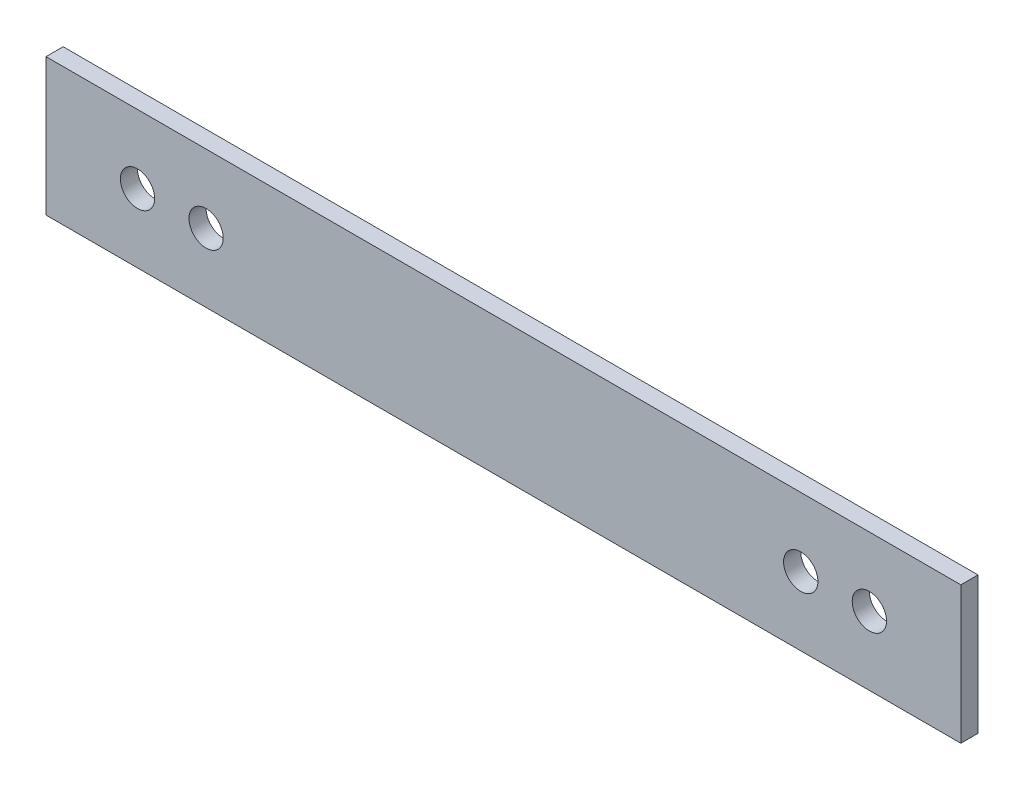
ISO-10303-21;
HEADER;
FILE_DESCRIPTION(('STEP AP214'),'2;1');
FILE_NAME('part.step','',(''),(''),'','','');
FILE_SCHEMA(('AUTOMOTIVE_DESIGN { 1 0 10303 214 1 1 1 1 }'));
ENDSEC;
DATA;
#1=APPLICATION_CONTEXT('core data for automotive mechanical design processes');
#2=APPLICATION_PROTOCOL_DEFINITION('international standard','automotive_design',2000,#1);
#3=PRODUCT_CONTEXT('',#1,'mechanical');
#4=PRODUCT('Part','Part','',(#3));
#5=PRODUCT_RELATED_PRODUCT_CATEGORY('part','',(#4));
#6=PRODUCT_DEFINITION_FORMATION('','',#4);
#7=PRODUCT_DEFINITION_CONTEXT('part definition',#1,'design');
#8=PRODUCT_DEFINITION('design','',#6,#7);
#9=PRODUCT_DEFINITION_SHAPE('','',#8);
#10=(LENGTH_UNIT() NAMED_UNIT(*) SI_UNIT(.MILLI.,.METRE.));
#11=(NAMED_UNIT(*) PLANE_ANGLE_UNIT() SI_UNIT($,.RADIAN.));
#12=(NAMED_UNIT(*) SI_UNIT($,.STERADIAN.) SOLID_ANGLE_UNIT());
#13=UNCERTAINTY_MEASURE_WITH_UNIT(LENGTH_MEASURE(1.E-05),#10,'distance_accuracy_value','');
#14=(GEOMETRIC_REPRESENTATION_CONTEXT(3) GLOBAL_UNCERTAINTY_ASSIGNED_CONTEXT((#13)) GLOBAL_UNIT_ASSIGNED_CONTEXT((#10,
#11,#12)) REPRESENTATION_CONTEXT('',''));
#15=CARTESIAN_POINT('',(0.,0.,0.));
#16=DIRECTION('',(0.,0.,1.));
#17=DIRECTION('',(1.,0.,0.));
#18=AXIS2_PLACEMENT_3D('',#15,#16,#17);
#19=CARTESIAN_POINT('',(0.,0.,4.7625));
#20=DIRECTION('',(0.,0.,-1.));
#21=DIRECTION('',(-1.,0.,0.));
#22=AXIS2_PLACEMENT_3D('',#19,#20,#21);
#23=PLANE('',#22);
#24=DIRECTION('',(0.,-1.,0.));
#25=VECTOR('',#24,1.);
#26=CARTESIAN_POINT('',(0.,0.,4.7625));
#27=LINE('',#26,#25);
#28=CARTESIAN_POINT('',(0.,38.1,4.7625));
#29=VERTEX_POINT('',#28);
#30=CARTESIAN_POINT('',(0.,0.,4.7625));
#31=VERTEX_POINT('',#30);
#32=EDGE_CURVE('E96',#29,#31,#27,.T.);
#33=ORIENTED_EDGE('',*,*,#32,.T.);
#34=DIRECTION('',(1.,0.,0.));
#35=VECTOR('',#34,1.);
#36=CARTESIAN_POINT('',(0.,0.,4.7625));
#37=LINE('',#36,#35);
#38=CARTESIAN_POINT('',(254.,0.,4.7625));
#39=VERTEX_POINT('',#38);
#40=EDGE_CURVE('E91',#31,#39,#37,.T.);
#41=ORIENTED_EDGE('',*,*,#40,.T.);
#42=DIRECTION('',(0.,1.,0.));
#43=VECTOR('',#42,1.);
#44=CARTESIAN_POINT('',(254.,0.,4.7625));
#45=LINE('',#44,#43);
#46=CARTESIAN_POINT('',(254.,38.1,4.7625));
#47=VERTEX_POINT('',#46);
#48=EDGE_CURVE('E94',#39,#47,#45,.T.);
#49=ORIENTED_EDGE('',*,*,#48,.T.);
#50=DIRECTION('',(-1.,0.,0.));
#51=VECTOR('',#50,1.);
#52=CARTESIAN_POINT('',(0.,38.1,4.7625));
#53=LINE('',#52,#51);
#54=EDGE_CURVE('E61',#47,#29,#53,.T.);
#55=ORIENTED_EDGE('',*,*,#54,.T.);
#56=EDGE_LOOP('',(#33,#41,#49,#55));
#57=FACE_BOUND('',#56,.T.);
#58=CARTESIAN_POINT('',(209.55,19.05,4.7625));
#59=DIRECTION('',(0.,0.,1.));
#60=DIRECTION('',(1.,0.,0.));
#61=AXIS2_PLACEMENT_3D('',#58,#59,#60);
#62=CIRCLE('',#61,4.76250000000001);
#63=CARTESIAN_POINT('',(204.7875,19.05,4.7625));
#64=VERTEX_POINT('',#63);
#65=EDGE_CURVE('E116',#64,#64,#62,.T.);
#66=ORIENTED_EDGE('',*,*,#65,.F.);
#67=EDGE_LOOP('',(#66));
#68=FACE_BOUND('',#67,.T.);
#69=CARTESIAN_POINT('',(228.6,19.05,4.7625));
#70=DIRECTION('',(0.,0.,1.));
#71=DIRECTION('',(1.,0.,0.));
#72=AXIS2_PLACEMENT_3D('',#69,#70,#71);
#73=CIRCLE('',#72,4.76250000000001);
#74=CARTESIAN_POINT('',(223.8375,19.05,4.7625));
#75=VERTEX_POINT('',#74);
#76=EDGE_CURVE('E138',#75,#75,#73,.T.);
#77=ORIENTED_EDGE('',*,*,#76,.F.);
#78=EDGE_LOOP('',(#77));
#79=FACE_BOUND('',#78,.T.);
#80=CARTESIAN_POINT('',(25.4,19.05,4.7625));
#81=DIRECTION('',(0.,0.,1.));
#82=DIRECTION('',(1.,0.,0.));
#83=AXIS2_PLACEMENT_3D('',#80,#81,#82);
#84=CIRCLE('',#83,4.7625);
#85=CARTESIAN_POINT('',(20.6375,19.05,4.7625));
#86=VERTEX_POINT('',#85);
#87=EDGE_CURVE('E146',#86,#86,#84,.T.);
#88=ORIENTED_EDGE('',*,*,#87,.F.);
#89=EDGE_LOOP('',(#88));
#90=FACE_BOUND('',#89,.T.);
#91=CARTESIAN_POINT('',(44.45,19.05,4.7625));
#92=DIRECTION('',(0.,0.,1.));
#93=DIRECTION('',(1.,0.,0.));
#94=AXIS2_PLACEMENT_3D('',#91,#92,#93);
#95=CIRCLE('',#94,4.7625);
#96=CARTESIAN_POINT('',(39.6875,19.05,4.7625));
#97=VERTEX_POINT('',#96);
#98=EDGE_CURVE('E154',#97,#97,#95,.T.);
#99=ORIENTED_EDGE('',*,*,#98,.F.);
#100=EDGE_LOOP('',(#99));
#101=FACE_BOUND('',#100,.T.);
#102=ADVANCED_FACE('F43',(#57,#68,#79,#90,#101),#23,.F.);
#103=CARTESIAN_POINT('',(0.,0.,0.));
#104=DIRECTION('',(0.,0.,-1.));
#105=DIRECTION('',(-1.,0.,0.));
#106=AXIS2_PLACEMENT_3D('',#103,#104,#105);
#107=PLANE('',#106);
#108=CARTESIAN_POINT('',(25.4,19.05,0.));
#109=DIRECTION('',(0.,0.,1.));
#110=DIRECTION('',(1.,0.,0.));
#111=AXIS2_PLACEMENT_3D('',#108,#109,#110);
#112=CIRCLE('',#111,4.7625);
#113=CARTESIAN_POINT('',(20.6375,19.05,0.));
#114=VERTEX_POINT('',#113);
#115=EDGE_CURVE('E150',#114,#114,#112,.T.);
#116=ORIENTED_EDGE('',*,*,#115,.T.);
#117=EDGE_LOOP('',(#116));
#118=FACE_BOUND('',#117,.T.);
#119=CARTESIAN_POINT('',(209.55,19.05,0.));
#120=DIRECTION('',(0.,0.,1.));
#121=DIRECTION('',(1.,0.,0.));
#122=AXIS2_PLACEMENT_3D('',#119,#120,#121);
#123=CIRCLE('',#122,4.76250000000001);
#124=CARTESIAN_POINT('',(204.7875,19.05,0.));
#125=VERTEX_POINT('',#124);
#126=EDGE_CURVE('E134',#125,#125,#123,.T.);
#127=ORIENTED_EDGE('',*,*,#126,.T.);
#128=EDGE_LOOP('',(#127));
#129=FACE_BOUND('',#128,.T.);
#130=DIRECTION('',(0.,-1.,0.));
#131=VECTOR('',#130,1.);
#132=CARTESIAN_POINT('',(0.,0.,0.));
#133=LINE('',#132,#131);
#134=CARTESIAN_POINT('',(0.,38.1,0.));
#135=VERTEX_POINT('',#134);
#136=CARTESIAN_POINT('',(0.,0.,0.));
#137=VERTEX_POINT('',#136);
#138=EDGE_CURVE('E112',#135,#137,#133,.T.);
#139=ORIENTED_EDGE('',*,*,#138,.F.);
#140=DIRECTION('',(-1.,0.,0.));
#141=VECTOR('',#140,1.);
#142=CARTESIAN_POINT('',(0.,38.1,0.));
#143=LINE('',#142,#141);
#144=CARTESIAN_POINT('',(254.,38.1,0.));
#145=VERTEX_POINT('',#144);
#146=EDGE_CURVE('E84',#145,#135,#143,.T.);
#147=ORIENTED_EDGE('',*,*,#146,.F.);
#148=DIRECTION('',(0.,1.,0.));
#149=VECTOR('',#148,1.);
#150=CARTESIAN_POINT('',(254.,0.,0.));
#151=LINE('',#150,#149);
#152=CARTESIAN_POINT('',(254.,0.,0.));
#153=VERTEX_POINT('',#152);
#154=EDGE_CURVE('E78',#153,#145,#151,.T.);
#155=ORIENTED_EDGE('',*,*,#154,.F.);
#156=DIRECTION('',(1.,0.,0.));
#157=VECTOR('',#156,1.);
#158=CARTESIAN_POINT('',(0.,0.,0.));
#159=LINE('',#158,#157);
#160=EDGE_CURVE('E101',#137,#153,#159,.T.);
#161=ORIENTED_EDGE('',*,*,#160,.F.);
#162=EDGE_LOOP('',(#139,#147,#155,#161));
#163=FACE_BOUND('',#162,.T.);
#164=CARTESIAN_POINT('',(228.6,19.05,0.));
#165=DIRECTION('',(0.,0.,1.));
#166=DIRECTION('',(1.,0.,0.));
#167=AXIS2_PLACEMENT_3D('',#164,#165,#166);
#168=CIRCLE('',#167,4.76250000000001);
#169=CARTESIAN_POINT('',(223.8375,19.05,0.));
#170=VERTEX_POINT('',#169);
#171=EDGE_CURVE('E142',#170,#170,#168,.T.);
#172=ORIENTED_EDGE('',*,*,#171,.T.);
#173=EDGE_LOOP('',(#172));
#174=FACE_BOUND('',#173,.T.);
#175=CARTESIAN_POINT('',(44.45,19.05,0.));
#176=DIRECTION('',(0.,0.,1.));
#177=DIRECTION('',(1.,0.,0.));
#178=AXIS2_PLACEMENT_3D('',#175,#176,#177);
#179=CIRCLE('',#178,4.7625);
#180=CARTESIAN_POINT('',(39.6875,19.05,0.));
#181=VERTEX_POINT('',#180);
#182=EDGE_CURVE('E158',#181,#181,#179,.T.);
#183=ORIENTED_EDGE('',*,*,#182,.T.);
#184=EDGE_LOOP('',(#183));
#185=FACE_BOUND('',#184,.T.);
#186=ADVANCED_FACE('F129',(#118,#129,#163,#174,#185),#107,.T.);
#187=CARTESIAN_POINT('',(0.,0.,4.7625));
#188=DIRECTION('',(1.,0.,0.));
#189=DIRECTION('',(0.,0.,-1.));
#190=AXIS2_PLACEMENT_3D('',#187,#188,#189);
#191=PLANE('',#190);
#192=ORIENTED_EDGE('',*,*,#138,.T.);
#193=DIRECTION('',(0.,0.,-1.));
#194=VECTOR('',#193,1.);
#195=CARTESIAN_POINT('',(0.,0.,4.7625));
#196=LINE('',#195,#194);
#197=EDGE_CURVE('E11',#31,#137,#196,.T.);
#198=ORIENTED_EDGE('',*,*,#197,.F.);
#199=ORIENTED_EDGE('',*,*,#32,.F.);
#200=DIRECTION('',(0.,0.,-1.));
#201=VECTOR('',#200,1.);
#202=CARTESIAN_POINT('',(0.,38.1,4.7625));
#203=LINE('',#202,#201);
#204=EDGE_CURVE('E108',#29,#135,#203,.T.);
#205=ORIENTED_EDGE('',*,*,#204,.T.);
#206=EDGE_LOOP('',(#192,#198,#199,#205));
#207=FACE_BOUND('',#206,.T.);
#208=ADVANCED_FACE('F45',(#207),#191,.F.);
#209=CARTESIAN_POINT('',(0.,0.,4.7625));
#210=DIRECTION('',(0.,1.,0.));
#211=DIRECTION('',(0.,0.,1.));
#212=AXIS2_PLACEMENT_3D('',#209,#210,#211);
#213=PLANE('',#212);
#214=ORIENTED_EDGE('',*,*,#160,.T.);
#215=DIRECTION('',(0.,0.,-1.));
#216=VECTOR('',#215,1.);
#217=CARTESIAN_POINT('',(254.,0.,4.7625));
#218=LINE('',#217,#216);
#219=EDGE_CURVE('E53',#39,#153,#218,.T.);
#220=ORIENTED_EDGE('',*,*,#219,.F.);
#221=ORIENTED_EDGE('',*,*,#40,.F.);
#222=ORIENTED_EDGE('',*,*,#197,.T.);
#223=EDGE_LOOP('',(#214,#220,#221,#222));
#224=FACE_BOUND('',#223,.T.);
#225=ADVANCED_FACE('F100',(#224),#213,.F.);
#226=CARTESIAN_POINT('',(254.,0.,4.7625));
#227=DIRECTION('',(-1.,0.,0.));
#228=DIRECTION('',(0.,0.,1.));
#229=AXIS2_PLACEMENT_3D('',#226,#227,#228);
#230=PLANE('',#229);
#231=ORIENTED_EDGE('',*,*,#154,.T.);
#232=DIRECTION('',(0.,0.,-1.));
#233=VECTOR('',#232,1.);
#234=CARTESIAN_POINT('',(254.,38.1,4.7625));
#235=LINE('',#234,#233);
#236=EDGE_CURVE('E103',#47,#145,#235,.T.);
#237=ORIENTED_EDGE('',*,*,#236,.F.);
#238=ORIENTED_EDGE('',*,*,#48,.F.);
#239=ORIENTED_EDGE('',*,*,#219,.T.);
#240=EDGE_LOOP('',(#231,#237,#238,#239));
#241=FACE_BOUND('',#240,.T.);
#242=ADVANCED_FACE('F104',(#241),#230,.F.);
#243=CARTESIAN_POINT('',(0.,38.1,4.7625));
#244=DIRECTION('',(0.,-1.,0.));
#245=DIRECTION('',(0.,0.,-1.));
#246=AXIS2_PLACEMENT_3D('',#243,#244,#245);
#247=PLANE('',#246);
#248=ORIENTED_EDGE('',*,*,#146,.T.);
#249=ORIENTED_EDGE('',*,*,#204,.F.);
#250=ORIENTED_EDGE('',*,*,#54,.F.);
#251=ORIENTED_EDGE('',*,*,#236,.T.);
#252=EDGE_LOOP('',(#248,#249,#250,#251));
#253=FACE_BOUND('',#252,.T.);
#254=ADVANCED_FACE('F126',(#253),#247,.F.);
#255=CARTESIAN_POINT('',(209.55,19.05,4.7625));
#256=DIRECTION('',(0.,0.,-1.));
#257=DIRECTION('',(-1.,0.,0.));
#258=AXIS2_PLACEMENT_3D('',#255,#256,#257);
#259=CYLINDRICAL_SURFACE('',#258,4.76250000000001);
#260=CARTESIAN_POINT('',(204.7875,19.05,4.7625));
#261=CARTESIAN_POINT('',(204.7875,19.05,4.712890625));
#262=CARTESIAN_POINT('',(204.7875,19.05,4.66328125));
#263=CARTESIAN_POINT('',(204.7875,19.05,4.5640625));
#264=CARTESIAN_POINT('',(204.7875,19.05,4.514453125));
#265=CARTESIAN_POINT('',(204.7875,19.05,4.415234375));
#266=CARTESIAN_POINT('',(204.7875,19.05,4.365625));
#267=CARTESIAN_POINT('',(204.7875,19.05,4.26640625));
#268=CARTESIAN_POINT('',(204.7875,19.05,4.216796875));
#269=CARTESIAN_POINT('',(204.7875,19.05,4.117578125));
#270=CARTESIAN_POINT('',(204.7875,19.05,4.06796875));
#271=CARTESIAN_POINT('',(204.7875,19.05,3.96875));
#272=CARTESIAN_POINT('',(204.7875,19.05,3.919140625));
#273=CARTESIAN_POINT('',(204.7875,19.05,3.819921875));
#274=CARTESIAN_POINT('',(204.7875,19.05,3.7703125));
#275=CARTESIAN_POINT('',(204.7875,19.05,3.67109375));
#276=CARTESIAN_POINT('',(204.7875,19.05,3.621484375));
#277=CARTESIAN_POINT('',(204.7875,19.05,3.522265625));
#278=CARTESIAN_POINT('',(204.7875,19.05,3.47265625));
#279=CARTESIAN_POINT('',(204.7875,19.05,3.3734375));
#280=CARTESIAN_POINT('',(204.7875,19.05,3.323828125));
#281=CARTESIAN_POINT('',(204.7875,19.05,3.224609375));
#282=CARTESIAN_POINT('',(204.7875,19.05,3.175));
#283=CARTESIAN_POINT('',(204.7875,19.05,3.07578125));
#284=CARTESIAN_POINT('',(204.7875,19.05,3.026171875));
#285=CARTESIAN_POINT('',(204.7875,19.05,2.926953125));
#286=CARTESIAN_POINT('',(204.7875,19.05,2.87734375));
#287=CARTESIAN_POINT('',(204.7875,19.05,2.778125));
#288=CARTESIAN_POINT('',(204.7875,19.05,2.728515625));
#289=CARTESIAN_POINT('',(204.7875,19.05,2.629296875));
#290=CARTESIAN_POINT('',(204.7875,19.05,2.5796875));
#291=CARTESIAN_POINT('',(204.7875,19.05,2.48046875));
#292=CARTESIAN_POINT('',(204.7875,19.05,2.430859375));
#293=CARTESIAN_POINT('',(204.7875,19.05,2.331640625));
#294=CARTESIAN_POINT('',(204.7875,19.05,2.28203125));
#295=CARTESIAN_POINT('',(204.7875,19.05,2.1828125));
#296=CARTESIAN_POINT('',(204.7875,19.05,2.133203125));
#297=CARTESIAN_POINT('',(204.7875,19.05,2.033984375));
#298=CARTESIAN_POINT('',(204.7875,19.05,1.984375));
#299=CARTESIAN_POINT('',(204.7875,19.05,1.88515625));
#300=CARTESIAN_POINT('',(204.7875,19.05,1.835546875));
#301=CARTESIAN_POINT('',(204.7875,19.05,1.736328125));
#302=CARTESIAN_POINT('',(204.7875,19.05,1.68671875));
#303=CARTESIAN_POINT('',(204.7875,19.05,1.5875));
#304=CARTESIAN_POINT('',(204.7875,19.05,1.537890625));
#305=CARTESIAN_POINT('',(204.7875,19.05,1.438671875));
#306=CARTESIAN_POINT('',(204.7875,19.05,1.3890625));
#307=CARTESIAN_POINT('',(204.7875,19.05,1.28984375));
#308=CARTESIAN_POINT('',(204.7875,19.05,1.240234375));
#309=CARTESIAN_POINT('',(204.7875,19.05,1.141015625));
#310=CARTESIAN_POINT('',(204.7875,19.05,1.09140625));
#311=CARTESIAN_POINT('',(204.7875,19.05,0.992187499999999));
#312=CARTESIAN_POINT('',(204.7875,19.05,0.942578124999999));
#313=CARTESIAN_POINT('',(204.7875,19.05,0.843359375));
#314=CARTESIAN_POINT('',(204.7875,19.05,0.79375));
#315=CARTESIAN_POINT('',(204.7875,19.05,0.69453125));
#316=CARTESIAN_POINT('',(204.7875,19.05,0.644921875));
#317=CARTESIAN_POINT('',(204.7875,19.05,0.545703125));
#318=CARTESIAN_POINT('',(204.7875,19.05,0.49609375));
#319=CARTESIAN_POINT('',(204.7875,19.05,0.396875));
#320=CARTESIAN_POINT('',(204.7875,19.05,0.347265625));
#321=CARTESIAN_POINT('',(204.7875,19.05,0.248046875));
#322=CARTESIAN_POINT('',(204.7875,19.05,0.1984375));
#323=CARTESIAN_POINT('',(204.7875,19.05,0.09921875));
#324=CARTESIAN_POINT('',(204.7875,19.05,0.049609375));
#325=CARTESIAN_POINT('',(204.7875,19.05,0.));
#326=B_SPLINE_CURVE_WITH_KNOTS('',3,(#260,#261,#262,#263,#264,#265,#266,#267,#268,#269,#270,
#271,#272,#273,#274,#275,#276,#277,#278,#279,#280,#281,#282,#283,#284,#285,#286,#287,#288,#289,
#290,#291,#292,#293,#294,#295,#296,#297,#298,#299,#300,#301,#302,#303,#304,#305,#306,#307,#308,
#309,#310,#311,#312,#313,#314,#315,#316,#317,#318,#319,#320,#321,#322,#323,#324,#325),
.UNSPECIFIED.,.F.,.F.,(4,2,2,2,2,2,2,2,2,2,2,2,2,2,2,2,2,2,2,2,2,2,2,2,2,2,2,2,2,2,2,2,4),(0.,
0.148828125,0.29765625,0.446484375,0.5953125,0.744140625,0.892968750000001,1.041796875,1.190625,
1.339453125,1.48828125,1.637109375,1.7859375,1.934765625,2.08359375,2.232421875,2.38125,
2.530078125,2.67890625,2.827734375,2.9765625,3.125390625,3.27421875,3.423046875,3.571875,
3.720703125,3.86953125,4.018359375,4.1671875,4.316015625,4.46484375,4.613671875,4.7625),.UNSPECIFIED.);
#327=EDGE_CURVE('BSEAM177',#64,#125,#326,.T.);
#328=ORIENTED_EDGE('',*,*,#65,.T.);
#329=ORIENTED_EDGE('',*,*,#126,.F.);
#330=ORIENTED_EDGE('',*,*,#327,.T.);
#331=ORIENTED_EDGE('',*,*,#327,.F.);
#332=EDGE_LOOP('',(#328,#330,#329,#331));
#333=FACE_BOUND('',#332,.T.);
#334=ADVANCED_FACE('F177',(#333),#259,.F.);
#335=CARTESIAN_POINT('',(228.6,19.05,4.7625));
#336=DIRECTION('',(0.,0.,-1.));
#337=DIRECTION('',(-1.,0.,0.));
#338=AXIS2_PLACEMENT_3D('',#335,#336,#337);
#339=CYLINDRICAL_SURFACE('',#338,4.76250000000001);
#340=CARTESIAN_POINT('',(223.8375,19.05,4.7625));
#341=CARTESIAN_POINT('',(223.8375,19.05,4.712890625));
#342=CARTESIAN_POINT('',(223.8375,19.05,4.66328125));
#343=CARTESIAN_POINT('',(223.8375,19.05,4.5640625));
#344=CARTESIAN_POINT('',(223.8375,19.05,4.514453125));
#345=CARTESIAN_POINT('',(223.8375,19.05,4.415234375));
#346=CARTESIAN_POINT('',(223.8375,19.05,4.365625));
#347=CARTESIAN_POINT('',(223.8375,19.05,4.26640625));
#348=CARTESIAN_POINT('',(223.8375,19.05,4.216796875));
#349=CARTESIAN_POINT('',(223.8375,19.05,4.117578125));
#350=CARTESIAN_POINT('',(223.8375,19.05,4.06796875));
#351=CARTESIAN_POINT('',(223.8375,19.05,3.96875));
#352=CARTESIAN_POINT('',(223.8375,19.05,3.919140625));
#353=CARTESIAN_POINT('',(223.8375,19.05,3.819921875));
#354=CARTESIAN_POINT('',(223.8375,19.05,3.7703125));
#355=CARTESIAN_POINT('',(223.8375,19.05,3.67109375));
#356=CARTESIAN_POINT('',(223.8375,19.05,3.621484375));
#357=CARTESIAN_POINT('',(223.8375,19.05,3.522265625));
#358=CARTESIAN_POINT('',(223.8375,19.05,3.47265625));
#359=CARTESIAN_POINT('',(223.8375,19.05,3.3734375));
#360=CARTESIAN_POINT('',(223.8375,19.05,3.323828125));
#361=CARTESIAN_POINT('',(223.8375,19.05,3.224609375));
#362=CARTESIAN_POINT('',(223.8375,19.05,3.175));
#363=CARTESIAN_POINT('',(223.8375,19.05,3.07578125));
#364=CARTESIAN_POINT('',(223.8375,19.05,3.026171875));
#365=CARTESIAN_POINT('',(223.8375,19.05,2.926953125));
#366=CARTESIAN_POINT('',(223.8375,19.05,2.87734375));
#367=CARTESIAN_POINT('',(223.8375,19.05,2.778125));
#368=CARTESIAN_POINT('',(223.8375,19.05,2.728515625));
#369=CARTESIAN_POINT('',(223.8375,19.05,2.629296875));
#370=CARTESIAN_POINT('',(223.8375,19.05,2.5796875));
#371=CARTESIAN_POINT('',(223.8375,19.05,2.48046875));
#372=CARTESIAN_POINT('',(223.8375,19.05,2.430859375));
#373=CARTESIAN_POINT('',(223.8375,19.05,2.331640625));
#374=CARTESIAN_POINT('',(223.8375,19.05,2.28203125));
#375=CARTESIAN_POINT('',(223.8375,19.05,2.1828125));
#376=CARTESIAN_POINT('',(223.8375,19.05,2.133203125));
#377=CARTESIAN_POINT('',(223.8375,19.05,2.033984375));
#378=CARTESIAN_POINT('',(223.8375,19.05,1.984375));
#379=CARTESIAN_POINT('',(223.8375,19.05,1.88515625));
#380=CARTESIAN_POINT('',(223.8375,19.05,1.835546875));
#381=CARTESIAN_POINT('',(223.8375,19.05,1.736328125));
#382=CARTESIAN_POINT('',(223.8375,19.05,1.68671875));
#383=CARTESIAN_POINT('',(223.8375,19.05,1.5875));
#384=CARTESIAN_POINT('',(223.8375,19.05,1.537890625));
#385=CARTESIAN_POINT('',(223.8375,19.05,1.438671875));
#386=CARTESIAN_POINT('',(223.8375,19.05,1.3890625));
#387=CARTESIAN_POINT('',(223.8375,19.05,1.28984375));
#388=CARTESIAN_POINT('',(223.8375,19.05,1.240234375));
#389=CARTESIAN_POINT('',(223.8375,19.05,1.141015625));
#390=CARTESIAN_POINT('',(223.8375,19.05,1.09140625));
#391=CARTESIAN_POINT('',(223.8375,19.05,0.992187499999999));
#392=CARTESIAN_POINT('',(223.8375,19.05,0.942578124999999));
#393=CARTESIAN_POINT('',(223.8375,19.05,0.843359375));
#394=CARTESIAN_POINT('',(223.8375,19.05,0.79375));
#395=CARTESIAN_POINT('',(223.8375,19.05,0.69453125));
#396=CARTESIAN_POINT('',(223.8375,19.05,0.644921875));
#397=CARTESIAN_POINT('',(223.8375,19.05,0.545703125));
#398=CARTESIAN_POINT('',(223.8375,19.05,0.49609375));
#399=CARTESIAN_POINT('',(223.8375,19.05,0.396875));
#400=CARTESIAN_POINT('',(223.8375,19.05,0.347265625));
#401=CARTESIAN_POINT('',(223.8375,19.05,0.248046875));
#402=CARTESIAN_POINT('',(223.8375,19.05,0.1984375));
#403=CARTESIAN_POINT('',(223.8375,19.05,0.09921875));
#404=CARTESIAN_POINT('',(223.8375,19.05,0.049609375));
#405=CARTESIAN_POINT('',(223.8375,19.05,0.));
#406=B_SPLINE_CURVE_WITH_KNOTS('',3,(#340,#341,#342,#343,#344,#345,#346,#347,#348,#349,#350,
#351,#352,#353,#354,#355,#356,#357,#358,#359,#360,#361,#362,#363,#364,#365,#366,#367,#368,#369,
#370,#371,#372,#373,#374,#375,#376,#377,#378,#379,#380,#381,#382,#383,#384,#385,#386,#387,#388,
#389,#390,#391,#392,#393,#394,#395,#396,#397,#398,#399,#400,#401,#402,#403,#404,#405),
.UNSPECIFIED.,.F.,.F.,(4,2,2,2,2,2,2,2,2,2,2,2,2,2,2,2,2,2,2,2,2,2,2,2,2,2,2,2,2,2,2,2,4),(0.,
0.148828125,0.29765625,0.446484375,0.5953125,0.744140625,0.892968750000001,1.041796875,1.190625,
1.339453125,1.48828125,1.637109375,1.7859375,1.934765625,2.08359375,2.232421875,2.38125,
2.530078125,2.67890625,2.827734375,2.9765625,3.125390625,3.27421875,3.423046875,3.571875,
3.720703125,3.86953125,4.018359375,4.1671875,4.316015625,4.46484375,4.613671875,4.7625),.UNSPECIFIED.);
#407=EDGE_CURVE('BSEAM231',#75,#170,#406,.T.);
#408=ORIENTED_EDGE('',*,*,#76,.T.);
#409=ORIENTED_EDGE('',*,*,#171,.F.);
#410=ORIENTED_EDGE('',*,*,#407,.T.);
#411=ORIENTED_EDGE('',*,*,#407,.F.);
#412=EDGE_LOOP('',(#408,#410,#409,#411));
#413=FACE_BOUND('',#412,.T.);
#414=ADVANCED_FACE('F231',(#413),#339,.F.);
#415=CARTESIAN_POINT('',(25.4,19.05,4.7625));
#416=DIRECTION('',(0.,0.,-1.));
#417=DIRECTION('',(-1.,0.,0.));
#418=AXIS2_PLACEMENT_3D('',#415,#416,#417);
#419=CYLINDRICAL_SURFACE('',#418,4.7625);
#420=CARTESIAN_POINT('',(20.6375,19.05,4.7625));
#421=CARTESIAN_POINT('',(20.6375,19.05,4.712890625));
#422=CARTESIAN_POINT('',(20.6375,19.05,4.66328125));
#423=CARTESIAN_POINT('',(20.6375,19.05,4.5640625));
#424=CARTESIAN_POINT('',(20.6375,19.05,4.514453125));
#425=CARTESIAN_POINT('',(20.6375,19.05,4.415234375));
#426=CARTESIAN_POINT('',(20.6375,19.05,4.365625));
#427=CARTESIAN_POINT('',(20.6375,19.05,4.26640625));
#428=CARTESIAN_POINT('',(20.6375,19.05,4.216796875));
#429=CARTESIAN_POINT('',(20.6375,19.05,4.117578125));
#430=CARTESIAN_POINT('',(20.6375,19.05,4.06796875));
#431=CARTESIAN_POINT('',(20.6375,19.05,3.96875));
#432=CARTESIAN_POINT('',(20.6375,19.05,3.919140625));
#433=CARTESIAN_POINT('',(20.6375,19.05,3.819921875));
#434=CARTESIAN_POINT('',(20.6375,19.05,3.7703125));
#435=CARTESIAN_POINT('',(20.6375,19.05,3.67109375));
#436=CARTESIAN_POINT('',(20.6375,19.05,3.621484375));
#437=CARTESIAN_POINT('',(20.6375,19.05,3.522265625));
#438=CARTESIAN_POINT('',(20.6375,19.05,3.47265625));
#439=CARTESIAN_POINT('',(20.6375,19.05,3.3734375));
#440=CARTESIAN_POINT('',(20.6375,19.05,3.323828125));
#441=CARTESIAN_POINT('',(20.6375,19.05,3.224609375));
#442=CARTESIAN_POINT('',(20.6375,19.05,3.175));
#443=CARTESIAN_POINT('',(20.6375,19.05,3.07578125));
#444=CARTESIAN_POINT('',(20.6375,19.05,3.026171875));
#445=CARTESIAN_POINT('',(20.6375,19.05,2.926953125));
#446=CARTESIAN_POINT('',(20.6375,19.05,2.87734375));
#447=CARTESIAN_POINT('',(20.6375,19.05,2.778125));
#448=CARTESIAN_POINT('',(20.6375,19.05,2.728515625));
#449=CARTESIAN_POINT('',(20.6375,19.05,2.629296875));
#450=CARTESIAN_POINT('',(20.6375,19.05,2.5796875));
#451=CARTESIAN_POINT('',(20.6375,19.05,2.48046875));
#452=CARTESIAN_POINT('',(20.6375,19.05,2.430859375));
#453=CARTESIAN_POINT('',(20.6375,19.05,2.331640625));
#454=CARTESIAN_POINT('',(20.6375,19.05,2.28203125));
#455=CARTESIAN_POINT('',(20.6375,19.05,2.1828125));
#456=CARTESIAN_POINT('',(20.6375,19.05,2.133203125));
#457=CARTESIAN_POINT('',(20.6375,19.05,2.033984375));
#458=CARTESIAN_POINT('',(20.6375,19.05,1.984375));
#459=CARTESIAN_POINT('',(20.6375,19.05,1.88515625));
#460=CARTESIAN_POINT('',(20.6375,19.05,1.835546875));
#461=CARTESIAN_POINT('',(20.6375,19.05,1.736328125));
#462=CARTESIAN_POINT('',(20.6375,19.05,1.68671875));
#463=CARTESIAN_POINT('',(20.6375,19.05,1.5875));
#464=CARTESIAN_POINT('',(20.6375,19.05,1.537890625));
#465=CARTESIAN_POINT('',(20.6375,19.05,1.438671875));
#466=CARTESIAN_POINT('',(20.6375,19.05,1.3890625));
#467=CARTESIAN_POINT('',(20.6375,19.05,1.28984375));
#468=CARTESIAN_POINT('',(20.6375,19.05,1.240234375));
#469=CARTESIAN_POINT('',(20.6375,19.05,1.141015625));
#470=CARTESIAN_POINT('',(20.6375,19.05,1.09140625));
#471=CARTESIAN_POINT('',(20.6375,19.05,0.992187499999999));
#472=CARTESIAN_POINT('',(20.6375,19.05,0.942578124999999));
#473=CARTESIAN_POINT('',(20.6375,19.05,0.843359375));
#474=CARTESIAN_POINT('',(20.6375,19.05,0.79375));
#475=CARTESIAN_POINT('',(20.6375,19.05,0.69453125));
#476=CARTESIAN_POINT('',(20.6375,19.05,0.644921875));
#477=CARTESIAN_POINT('',(20.6375,19.05,0.545703125));
#478=CARTESIAN_POINT('',(20.6375,19.05,0.49609375));
#479=CARTESIAN_POINT('',(20.6375,19.05,0.396875));
#480=CARTESIAN_POINT('',(20.6375,19.05,0.347265625));
#481=CARTESIAN_POINT('',(20.6375,19.05,0.248046875));
#482=CARTESIAN_POINT('',(20.6375,19.05,0.1984375));
#483=CARTESIAN_POINT('',(20.6375,19.05,0.09921875));
#484=CARTESIAN_POINT('',(20.6375,19.05,0.049609375));
#485=CARTESIAN_POINT('',(20.6375,19.05,0.));
#486=B_SPLINE_CURVE_WITH_KNOTS('',3,(#420,#421,#422,#423,#424,#425,#426,#427,#428,#429,#430,
#431,#432,#433,#434,#435,#436,#437,#438,#439,#440,#441,#442,#443,#444,#445,#446,#447,#448,#449,
#450,#451,#452,#453,#454,#455,#456,#457,#458,#459,#460,#461,#462,#463,#464,#465,#466,#467,#468,
#469,#470,#471,#472,#473,#474,#475,#476,#477,#478,#479,#480,#481,#482,#483,#484,#485),
.UNSPECIFIED.,.F.,.F.,(4,2,2,2,2,2,2,2,2,2,2,2,2,2,2,2,2,2,2,2,2,2,2,2,2,2,2,2,2,2,2,2,4),(0.,
0.148828125,0.29765625,0.446484375,0.5953125,0.744140625,0.892968750000001,1.041796875,1.190625,
1.339453125,1.48828125,1.637109375,1.7859375,1.934765625,2.08359375,2.232421875,2.38125,
2.530078125,2.67890625,2.827734375,2.9765625,3.125390625,3.27421875,3.423046875,3.571875,
3.720703125,3.86953125,4.018359375,4.1671875,4.316015625,4.46484375,4.613671875,4.7625),.UNSPECIFIED.);
#487=EDGE_CURVE('BSEAM240',#86,#114,#486,.T.);
#488=ORIENTED_EDGE('',*,*,#87,.T.);
#489=ORIENTED_EDGE('',*,*,#115,.F.);
#490=ORIENTED_EDGE('',*,*,#487,.T.);
#491=ORIENTED_EDGE('',*,*,#487,.F.);
#492=EDGE_LOOP('',(#488,#490,#489,#491));
#493=FACE_BOUND('',#492,.T.);
#494=ADVANCED_FACE('F240',(#493),#419,.F.);
#495=CARTESIAN_POINT('',(44.45,19.05,4.7625));
#496=DIRECTION('',(0.,0.,-1.));
#497=DIRECTION('',(-1.,0.,0.));
#498=AXIS2_PLACEMENT_3D('',#495,#496,#497);
#499=CYLINDRICAL_SURFACE('',#498,4.7625);
#500=CARTESIAN_POINT('',(39.6875,19.05,4.7625));
#501=CARTESIAN_POINT('',(39.6875,19.05,4.712890625));
#502=CARTESIAN_POINT('',(39.6875,19.05,4.66328125));
#503=CARTESIAN_POINT('',(39.6875,19.05,4.5640625));
#504=CARTESIAN_POINT('',(39.6875,19.05,4.514453125));
#505=CARTESIAN_POINT('',(39.6875,19.05,4.415234375));
#506=CARTESIAN_POINT('',(39.6875,19.05,4.365625));
#507=CARTESIAN_POINT('',(39.6875,19.05,4.26640625));
#508=CARTESIAN_POINT('',(39.6875,19.05,4.216796875));
#509=CARTESIAN_POINT('',(39.6875,19.05,4.117578125));
#510=CARTESIAN_POINT('',(39.6875,19.05,4.06796875));
#511=CARTESIAN_POINT('',(39.6875,19.05,3.96875));
#512=CARTESIAN_POINT('',(39.6875,19.05,3.919140625));
#513=CARTESIAN_POINT('',(39.6875,19.05,3.819921875));
#514=CARTESIAN_POINT('',(39.6875,19.05,3.7703125));
#515=CARTESIAN_POINT('',(39.6875,19.05,3.67109375));
#516=CARTESIAN_POINT('',(39.6875,19.05,3.621484375));
#517=CARTESIAN_POINT('',(39.6875,19.05,3.522265625));
#518=CARTESIAN_POINT('',(39.6875,19.05,3.47265625));
#519=CARTESIAN_POINT('',(39.6875,19.05,3.3734375));
#520=CARTESIAN_POINT('',(39.6875,19.05,3.323828125));
#521=CARTESIAN_POINT('',(39.6875,19.05,3.224609375));
#522=CARTESIAN_POINT('',(39.6875,19.05,3.175));
#523=CARTESIAN_POINT('',(39.6875,19.05,3.07578125));
#524=CARTESIAN_POINT('',(39.6875,19.05,3.026171875));
#525=CARTESIAN_POINT('',(39.6875,19.05,2.926953125));
#526=CARTESIAN_POINT('',(39.6875,19.05,2.87734375));
#527=CARTESIAN_POINT('',(39.6875,19.05,2.778125));
#528=CARTESIAN_POINT('',(39.6875,19.05,2.728515625));
#529=CARTESIAN_POINT('',(39.6875,19.05,2.629296875));
#530=CARTESIAN_POINT('',(39.6875,19.05,2.5796875));
#531=CARTESIAN_POINT('',(39.6875,19.05,2.48046875));
#532=CARTESIAN_POINT('',(39.6875,19.05,2.430859375));
#533=CARTESIAN_POINT('',(39.6875,19.05,2.331640625));
#534=CARTESIAN_POINT('',(39.6875,19.05,2.28203125));
#535=CARTESIAN_POINT('',(39.6875,19.05,2.1828125));
#536=CARTESIAN_POINT('',(39.6875,19.05,2.133203125));
#537=CARTESIAN_POINT('',(39.6875,19.05,2.033984375));
#538=CARTESIAN_POINT('',(39.6875,19.05,1.984375));
#539=CARTESIAN_POINT('',(39.6875,19.05,1.88515625));
#540=CARTESIAN_POINT('',(39.6875,19.05,1.835546875));
#541=CARTESIAN_POINT('',(39.6875,19.05,1.736328125));
#542=CARTESIAN_POINT('',(39.6875,19.05,1.68671875));
#543=CARTESIAN_POINT('',(39.6875,19.05,1.5875));
#544=CARTESIAN_POINT('',(39.6875,19.05,1.537890625));
#545=CARTESIAN_POINT('',(39.6875,19.05,1.438671875));
#546=CARTESIAN_POINT('',(39.6875,19.05,1.3890625));
#547=CARTESIAN_POINT('',(39.6875,19.05,1.28984375));
#548=CARTESIAN_POINT('',(39.6875,19.05,1.240234375));
#549=CARTESIAN_POINT('',(39.6875,19.05,1.141015625));
#550=CARTESIAN_POINT('',(39.6875,19.05,1.09140625));
#551=CARTESIAN_POINT('',(39.6875,19.05,0.992187499999999));
#552=CARTESIAN_POINT('',(39.6875,19.05,0.942578124999999));
#553=CARTESIAN_POINT('',(39.6875,19.05,0.843359375));
#554=CARTESIAN_POINT('',(39.6875,19.05,0.79375));
#555=CARTESIAN_POINT('',(39.6875,19.05,0.69453125));
#556=CARTESIAN_POINT('',(39.6875,19.05,0.644921875));
#557=CARTESIAN_POINT('',(39.6875,19.05,0.545703125));
#558=CARTESIAN_POINT('',(39.6875,19.05,0.49609375));
#559=CARTESIAN_POINT('',(39.6875,19.05,0.396875));
#560=CARTESIAN_POINT('',(39.6875,19.05,0.347265625));
#561=CARTESIAN_POINT('',(39.6875,19.05,0.248046875));
#562=CARTESIAN_POINT('',(39.6875,19.05,0.1984375));
#563=CARTESIAN_POINT('',(39.6875,19.05,0.09921875));
#564=CARTESIAN_POINT('',(39.6875,19.05,0.049609375));
#565=CARTESIAN_POINT('',(39.6875,19.05,0.));
#566=B_SPLINE_CURVE_WITH_KNOTS('',3,(#500,#501,#502,#503,#504,#505,#506,#507,#508,#509,#510,
#511,#512,#513,#514,#515,#516,#517,#518,#519,#520,#521,#522,#523,#524,#525,#526,#527,#528,#529,
#530,#531,#532,#533,#534,#535,#536,#537,#538,#539,#540,#541,#542,#543,#544,#545,#546,#547,#548,
#549,#550,#551,#552,#553,#554,#555,#556,#557,#558,#559,#560,#561,#562,#563,#564,#565),
.UNSPECIFIED.,.F.,.F.,(4,2,2,2,2,2,2,2,2,2,2,2,2,2,2,2,2,2,2,2,2,2,2,2,2,2,2,2,2,2,2,2,4),(0.,
0.148828125,0.29765625,0.446484375,0.5953125,0.744140625,0.892968750000001,1.041796875,1.190625,
1.339453125,1.48828125,1.637109375,1.7859375,1.934765625,2.08359375,2.232421875,2.38125,
2.530078125,2.67890625,2.827734375,2.9765625,3.125390625,3.27421875,3.423046875,3.571875,
3.720703125,3.86953125,4.018359375,4.1671875,4.316015625,4.46484375,4.613671875,4.7625),.UNSPECIFIED.);
#567=EDGE_CURVE('BSEAM166',#97,#181,#566,.T.);
#568=ORIENTED_EDGE('',*,*,#98,.T.);
#569=ORIENTED_EDGE('',*,*,#182,.F.);
#570=ORIENTED_EDGE('',*,*,#567,.T.);
#571=ORIENTED_EDGE('',*,*,#567,.F.);
#572=EDGE_LOOP('',(#568,#570,#569,#571));
#573=FACE_BOUND('',#572,.T.);
#574=ADVANCED_FACE('F166',(#573),#499,.F.);
#575=CLOSED_SHELL('',(#102,#186,#208,#225,#242,#254,#334,#414,#494,#574));
#576=MANIFOLD_SOLID_BREP('B2',#575);
#577=ADVANCED_BREP_SHAPE_REPRESENTATION('',(#18,#576),#14);
#578=SHAPE_DEFINITION_REPRESENTATION(#9,#577);
ENDSEC;
END-ISO-10303-21;
